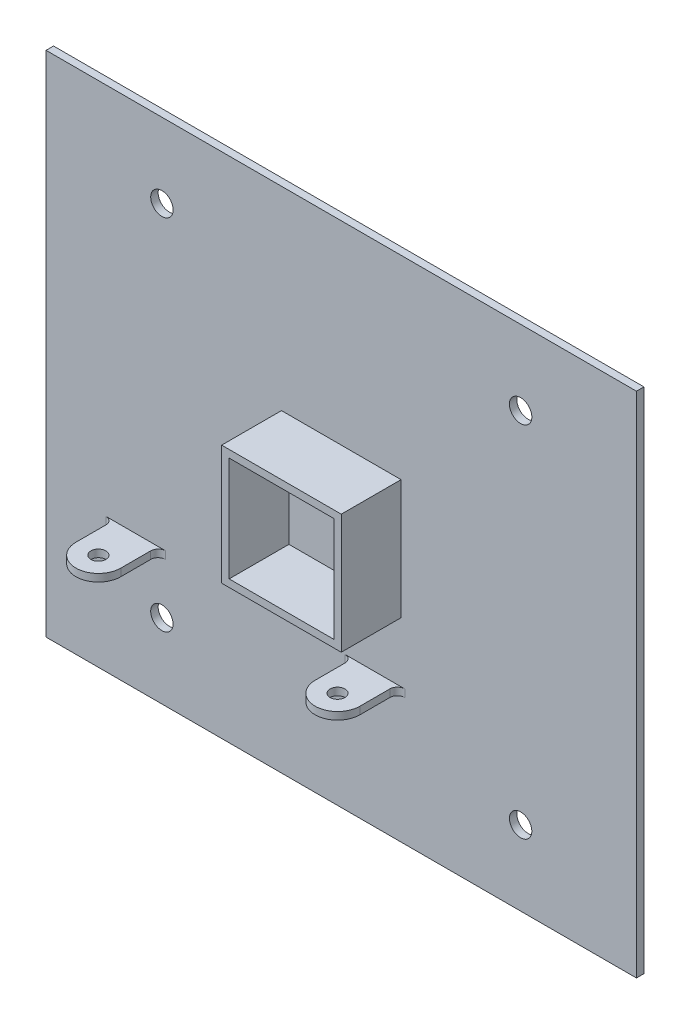
ISO-10303-21;
HEADER;
FILE_DESCRIPTION(('STEP AP214'),'2;1');
FILE_NAME('part.step','',(''),(''),'','','');
FILE_SCHEMA(('AUTOMOTIVE_DESIGN { 1 0 10303 214 1 1 1 1 }'));
ENDSEC;
DATA;
#1=APPLICATION_CONTEXT('core data for automotive mechanical design processes');
#2=APPLICATION_PROTOCOL_DEFINITION('international standard','automotive_design',2000,#1);
#3=PRODUCT_CONTEXT('',#1,'mechanical');
#4=PRODUCT('Part','Part','',(#3));
#5=PRODUCT_RELATED_PRODUCT_CATEGORY('part','',(#4));
#6=PRODUCT_DEFINITION_FORMATION('','',#4);
#7=PRODUCT_DEFINITION_CONTEXT('part definition',#1,'design');
#8=PRODUCT_DEFINITION('design','',#6,#7);
#9=PRODUCT_DEFINITION_SHAPE('','',#8);
#10=(LENGTH_UNIT() NAMED_UNIT(*) SI_UNIT(.MILLI.,.METRE.));
#11=(NAMED_UNIT(*) PLANE_ANGLE_UNIT() SI_UNIT($,.RADIAN.));
#12=(NAMED_UNIT(*) SI_UNIT($,.STERADIAN.) SOLID_ANGLE_UNIT());
#13=UNCERTAINTY_MEASURE_WITH_UNIT(LENGTH_MEASURE(1.E-05),#10,'distance_accuracy_value','');
#14=(GEOMETRIC_REPRESENTATION_CONTEXT(3) GLOBAL_UNCERTAINTY_ASSIGNED_CONTEXT((#13)) GLOBAL_UNIT_ASSIGNED_CONTEXT((#10,
#11,#12)) REPRESENTATION_CONTEXT('',''));
#15=CARTESIAN_POINT('',(0.,0.,0.));
#16=DIRECTION('',(0.,0.,1.));
#17=DIRECTION('',(1.,0.,0.));
#18=AXIS2_PLACEMENT_3D('',#15,#16,#17);
#19=CARTESIAN_POINT('',(0.,0.,101.6));
#20=DIRECTION('',(0.,0.,-1.));
#21=DIRECTION('',(-1.,0.,0.));
#22=AXIS2_PLACEMENT_3D('',#19,#20,#21);
#23=PLANE('',#22);
#24=DIRECTION('',(0.,-1.,0.));
#25=VECTOR('',#24,1.);
#26=CARTESIAN_POINT('',(-125.4125,0.,101.6));
#27=LINE('',#26,#25);
#28=CARTESIAN_POINT('',(-125.4125,107.95,101.6));
#29=VERTEX_POINT('',#28);
#30=CARTESIAN_POINT('',(-125.4125,-107.95,101.6));
#31=VERTEX_POINT('',#30);
#32=EDGE_CURVE('E378',#29,#31,#27,.T.);
#33=ORIENTED_EDGE('',*,*,#32,.T.);
#34=DIRECTION('',(-1.,0.,0.));
#35=VECTOR('',#34,1.);
#36=CARTESIAN_POINT('',(0.,-107.95,101.6));
#37=LINE('',#36,#35);
#38=CARTESIAN_POINT('',(125.4125,-107.95,101.6));
#39=VERTEX_POINT('',#38);
#40=EDGE_CURVE('E382',#39,#31,#37,.T.);
#41=ORIENTED_EDGE('',*,*,#40,.F.);
#42=DIRECTION('',(0.,-1.,0.));
#43=VECTOR('',#42,1.);
#44=CARTESIAN_POINT('',(125.4125,0.,101.6));
#45=LINE('',#44,#43);
#46=CARTESIAN_POINT('',(125.4125,107.95,101.6));
#47=VERTEX_POINT('',#46);
#48=EDGE_CURVE('E395',#47,#39,#45,.T.);
#49=ORIENTED_EDGE('',*,*,#48,.F.);
#50=DIRECTION('',(-1.,0.,0.));
#51=VECTOR('',#50,1.);
#52=CARTESIAN_POINT('',(0.,107.95,101.6));
#53=LINE('',#52,#51);
#54=EDGE_CURVE('E392',#47,#29,#53,.T.);
#55=ORIENTED_EDGE('',*,*,#54,.T.);
#56=EDGE_LOOP('',(#33,#41,#49,#55));
#57=FACE_BOUND('',#56,.T.);
#58=DIRECTION('',(0.,1.,0.));
#59=VECTOR('',#58,1.);
#60=CARTESIAN_POINT('',(-74.6125,-50.8,101.6));
#61=LINE('',#60,#59);
#62=CARTESIAN_POINT('',(-74.6125,-53.975,101.6));
#63=VERTEX_POINT('',#62);
#64=CARTESIAN_POINT('',(-74.6125,-50.8,101.6));
#65=VERTEX_POINT('',#64);
#66=EDGE_CURVE('E519',#63,#65,#61,.T.);
#67=ORIENTED_EDGE('',*,*,#66,.F.);
#68=DIRECTION('',(1.,0.,0.));
#69=VECTOR('',#68,1.);
#70=CARTESIAN_POINT('',(-74.6125,-53.975,101.6));
#71=LINE('',#70,#69);
#72=CARTESIAN_POINT('',(-100.0125,-53.975,101.6));
#73=VERTEX_POINT('',#72);
#74=EDGE_CURVE('E526',#73,#63,#71,.T.);
#75=ORIENTED_EDGE('',*,*,#74,.F.);
#76=DIRECTION('',(0.,-1.,0.));
#77=VECTOR('',#76,1.);
#78=CARTESIAN_POINT('',(-100.0125,-50.8,101.6));
#79=LINE('',#78,#77);
#80=CARTESIAN_POINT('',(-100.0125,-50.8,101.6));
#81=VERTEX_POINT('',#80);
#82=EDGE_CURVE('E524',#81,#73,#79,.T.);
#83=ORIENTED_EDGE('',*,*,#82,.F.);
#84=DIRECTION('',(-1.,0.,0.));
#85=VECTOR('',#84,1.);
#86=CARTESIAN_POINT('',(-74.6125,-50.8,101.6));
#87=LINE('',#86,#85);
#88=EDGE_CURVE('E521',#65,#81,#87,.T.);
#89=ORIENTED_EDGE('',*,*,#88,.F.);
#90=EDGE_LOOP('',(#67,#75,#83,#89));
#91=FACE_BOUND('',#90,.T.);
#92=DIRECTION('',(0.,-1.,0.));
#93=VECTOR('',#92,1.);
#94=CARTESIAN_POINT('',(1.58750000000003,-50.8,101.6));
#95=LINE('',#94,#93);
#96=CARTESIAN_POINT('',(1.58750000000003,-50.8,101.6));
#97=VERTEX_POINT('',#96);
#98=CARTESIAN_POINT('',(1.58750000000002,-53.975,101.6));
#99=VERTEX_POINT('',#98);
#100=EDGE_CURVE('E529',#97,#99,#95,.T.);
#101=ORIENTED_EDGE('',*,*,#100,.F.);
#102=DIRECTION('',(-1.,0.,0.));
#103=VECTOR('',#102,1.);
#104=CARTESIAN_POINT('',(1.58750000000003,-50.8,101.6));
#105=LINE('',#104,#103);
#106=CARTESIAN_POINT('',(26.9875,-50.8,101.6));
#107=VERTEX_POINT('',#106);
#108=EDGE_CURVE('E13',#107,#97,#105,.T.);
#109=ORIENTED_EDGE('',*,*,#108,.F.);
#110=DIRECTION('',(0.,1.,0.));
#111=VECTOR('',#110,1.);
#112=CARTESIAN_POINT('',(26.9875,-50.8,101.6));
#113=LINE('',#112,#111);
#114=CARTESIAN_POINT('',(26.9875,-53.975,101.6));
#115=VERTEX_POINT('',#114);
#116=EDGE_CURVE('E157',#115,#107,#113,.T.);
#117=ORIENTED_EDGE('',*,*,#116,.F.);
#118=DIRECTION('',(1.,0.,0.));
#119=VECTOR('',#118,1.);
#120=CARTESIAN_POINT('',(1.58750000000002,-53.975,101.6));
#121=LINE('',#120,#119);
#122=EDGE_CURVE('E531',#99,#115,#121,.T.);
#123=ORIENTED_EDGE('',*,*,#122,.F.);
#124=EDGE_LOOP('',(#101,#109,#117,#123));
#125=FACE_BOUND('',#124,.T.);
#126=CARTESIAN_POINT('',(-76.2,-76.2,101.6));
#127=DIRECTION('',(0.,0.,-1.));
#128=DIRECTION('',(-1.,0.,0.));
#129=AXIS2_PLACEMENT_3D('',#126,#127,#128);
#130=CIRCLE('',#129,4.7625);
#131=CARTESIAN_POINT('',(-80.9625,-76.2,101.6));
#132=VERTEX_POINT('',#131);
#133=EDGE_CURVE('E418',#132,#132,#130,.F.);
#134=ORIENTED_EDGE('',*,*,#133,.F.);
#135=EDGE_LOOP('',(#134));
#136=FACE_BOUND('',#135,.T.);
#137=CARTESIAN_POINT('',(76.2,-76.2,101.6));
#138=DIRECTION('',(0.,0.,-1.));
#139=DIRECTION('',(-1.,0.,0.));
#140=AXIS2_PLACEMENT_3D('',#137,#138,#139);
#141=CIRCLE('',#140,4.7625);
#142=CARTESIAN_POINT('',(71.4375,-76.2,101.6));
#143=VERTEX_POINT('',#142);
#144=EDGE_CURVE('E412',#143,#143,#141,.F.);
#145=ORIENTED_EDGE('',*,*,#144,.F.);
#146=EDGE_LOOP('',(#145));
#147=FACE_BOUND('',#146,.T.);
#148=CARTESIAN_POINT('',(-76.2,76.2,101.6));
#149=DIRECTION('',(0.,0.,-1.));
#150=DIRECTION('',(-1.,0.,0.));
#151=AXIS2_PLACEMENT_3D('',#148,#149,#150);
#152=CIRCLE('',#151,4.7625);
#153=CARTESIAN_POINT('',(-80.9625,76.2,101.6));
#154=VERTEX_POINT('',#153);
#155=EDGE_CURVE('E424',#154,#154,#152,.F.);
#156=ORIENTED_EDGE('',*,*,#155,.F.);
#157=EDGE_LOOP('',(#156));
#158=FACE_BOUND('',#157,.T.);
#159=CARTESIAN_POINT('',(76.2,76.2,101.6));
#160=DIRECTION('',(0.,0.,-1.));
#161=DIRECTION('',(-1.,0.,0.));
#162=AXIS2_PLACEMENT_3D('',#159,#160,#161);
#163=CIRCLE('',#162,4.7625);
#164=CARTESIAN_POINT('',(71.4375,76.2,101.6));
#165=VERTEX_POINT('',#164);
#166=EDGE_CURVE('E430',#165,#165,#163,.F.);
#167=ORIENTED_EDGE('',*,*,#166,.F.);
#168=EDGE_LOOP('',(#167));
#169=FACE_BOUND('',#168,.T.);
#170=DIRECTION('',(0.,1.,0.));
#171=VECTOR('',#170,1.);
#172=CARTESIAN_POINT('',(25.4,-25.4,101.6));
#173=LINE('',#172,#171);
#174=CARTESIAN_POINT('',(25.4,-25.4,101.6));
#175=VERTEX_POINT('',#174);
#176=CARTESIAN_POINT('',(25.4,25.4,101.6));
#177=VERTEX_POINT('',#176);
#178=EDGE_CURVE('E327',#175,#177,#173,.T.);
#179=ORIENTED_EDGE('',*,*,#178,.F.);
#180=DIRECTION('',(1.,0.,0.));
#181=VECTOR('',#180,1.);
#182=CARTESIAN_POINT('',(-25.4,-25.4,101.6));
#183=LINE('',#182,#181);
#184=CARTESIAN_POINT('',(-25.4,-25.4,101.6));
#185=VERTEX_POINT('',#184);
#186=EDGE_CURVE('E355',#185,#175,#183,.T.);
#187=ORIENTED_EDGE('',*,*,#186,.F.);
#188=DIRECTION('',(0.,-1.,0.));
#189=VECTOR('',#188,1.);
#190=CARTESIAN_POINT('',(-25.4,-25.4,101.6));
#191=LINE('',#190,#189);
#192=CARTESIAN_POINT('',(-25.4,25.4,101.6));
#193=VERTEX_POINT('',#192);
#194=EDGE_CURVE('E169',#193,#185,#191,.T.);
#195=ORIENTED_EDGE('',*,*,#194,.F.);
#196=DIRECTION('',(-1.,0.,0.));
#197=VECTOR('',#196,1.);
#198=CARTESIAN_POINT('',(-25.4,25.4,101.6));
#199=LINE('',#198,#197);
#200=EDGE_CURVE('E164',#177,#193,#199,.T.);
#201=ORIENTED_EDGE('',*,*,#200,.F.);
#202=EDGE_LOOP('',(#179,#187,#195,#201));
#203=FACE_BOUND('',#202,.T.);
#204=ADVANCED_FACE('F149',(#57,#91,#125,#136,#147,#158,#169,#203),#23,.F.);
#205=CARTESIAN_POINT('',(0.,0.,98.425));
#206=DIRECTION('',(0.,0.,-1.));
#207=DIRECTION('',(-1.,0.,0.));
#208=AXIS2_PLACEMENT_3D('',#205,#206,#207);
#209=PLANE('',#208);
#210=CARTESIAN_POINT('',(76.2,76.2,98.425));
#211=DIRECTION('',(0.,0.,-1.));
#212=DIRECTION('',(-1.,0.,0.));
#213=AXIS2_PLACEMENT_3D('',#210,#211,#212);
#214=CIRCLE('',#213,4.7625);
#215=CARTESIAN_POINT('',(71.4375,76.2,98.425));
#216=VERTEX_POINT('',#215);
#217=EDGE_CURVE('E427',#216,#216,#214,.T.);
#218=ORIENTED_EDGE('',*,*,#217,.F.);
#219=EDGE_LOOP('',(#218));
#220=FACE_BOUND('',#219,.T.);
#221=CARTESIAN_POINT('',(-76.2,76.2,98.425));
#222=DIRECTION('',(0.,0.,-1.));
#223=DIRECTION('',(-1.,0.,0.));
#224=AXIS2_PLACEMENT_3D('',#221,#222,#223);
#225=CIRCLE('',#224,4.7625);
#226=CARTESIAN_POINT('',(-80.9625,76.2,98.425));
#227=VERTEX_POINT('',#226);
#228=EDGE_CURVE('E421',#227,#227,#225,.T.);
#229=ORIENTED_EDGE('',*,*,#228,.F.);
#230=EDGE_LOOP('',(#229));
#231=FACE_BOUND('',#230,.T.);
#232=CARTESIAN_POINT('',(-76.2,-76.2,98.425));
#233=DIRECTION('',(0.,0.,-1.));
#234=DIRECTION('',(-1.,0.,0.));
#235=AXIS2_PLACEMENT_3D('',#232,#233,#234);
#236=CIRCLE('',#235,4.7625);
#237=CARTESIAN_POINT('',(-80.9625,-76.2,98.425));
#238=VERTEX_POINT('',#237);
#239=EDGE_CURVE('E415',#238,#238,#236,.T.);
#240=ORIENTED_EDGE('',*,*,#239,.F.);
#241=EDGE_LOOP('',(#240));
#242=FACE_BOUND('',#241,.T.);
#243=CARTESIAN_POINT('',(76.2,-76.2,98.425));
#244=DIRECTION('',(0.,0.,-1.));
#245=DIRECTION('',(-1.,0.,0.));
#246=AXIS2_PLACEMENT_3D('',#243,#244,#245);
#247=CIRCLE('',#246,4.7625);
#248=CARTESIAN_POINT('',(71.4375,-76.2,98.425));
#249=VERTEX_POINT('',#248);
#250=EDGE_CURVE('E402',#249,#249,#247,.T.);
#251=ORIENTED_EDGE('',*,*,#250,.F.);
#252=EDGE_LOOP('',(#251));
#253=FACE_BOUND('',#252,.T.);
#254=DIRECTION('',(-1.,0.,0.));
#255=VECTOR('',#254,1.);
#256=CARTESIAN_POINT('',(0.,-107.95,98.425));
#257=LINE('',#256,#255);
#258=CARTESIAN_POINT('',(125.4125,-107.95,98.425));
#259=VERTEX_POINT('',#258);
#260=CARTESIAN_POINT('',(-125.4125,-107.95,98.425));
#261=VERTEX_POINT('',#260);
#262=EDGE_CURVE('E387',#259,#261,#257,.T.);
#263=ORIENTED_EDGE('',*,*,#262,.T.);
#264=DIRECTION('',(0.,-1.,0.));
#265=VECTOR('',#264,1.);
#266=CARTESIAN_POINT('',(-125.4125,0.,98.425));
#267=LINE('',#266,#265);
#268=CARTESIAN_POINT('',(-125.4125,107.95,98.425));
#269=VERTEX_POINT('',#268);
#270=EDGE_CURVE('E379',#269,#261,#267,.T.);
#271=ORIENTED_EDGE('',*,*,#270,.F.);
#272=DIRECTION('',(-1.,0.,0.));
#273=VECTOR('',#272,1.);
#274=CARTESIAN_POINT('',(0.,107.95,98.425));
#275=LINE('',#274,#273);
#276=CARTESIAN_POINT('',(125.4125,107.95,98.425));
#277=VERTEX_POINT('',#276);
#278=EDGE_CURVE('E381',#277,#269,#275,.T.);
#279=ORIENTED_EDGE('',*,*,#278,.F.);
#280=DIRECTION('',(0.,-1.,0.));
#281=VECTOR('',#280,1.);
#282=CARTESIAN_POINT('',(125.4125,0.,98.425));
#283=LINE('',#282,#281);
#284=EDGE_CURVE('E384',#277,#259,#283,.T.);
#285=ORIENTED_EDGE('',*,*,#284,.T.);
#286=EDGE_LOOP('',(#263,#271,#279,#285));
#287=FACE_BOUND('',#286,.T.);
#288=ADVANCED_FACE('F576',(#220,#231,#242,#253,#287),#209,.T.);
#289=CARTESIAN_POINT('',(1.58750000000002,-53.975,127.));
#290=DIRECTION('',(0.,1.,0.));
#291=DIRECTION('',(0.,0.,1.));
#292=AXIS2_PLACEMENT_3D('',#289,#290,#291);
#293=PLANE('',#292);
#294=CARTESIAN_POINT('',(14.2875,-53.975,117.475));
#295=DIRECTION('',(0.,-1.,0.));
#296=DIRECTION('',(1.,0.,0.));
#297=AXIS2_PLACEMENT_3D('',#294,#295,#296);
#298=CIRCLE('',#297,3.175);
#299=CARTESIAN_POINT('',(17.4625,-53.975,117.475));
#300=VERTEX_POINT('',#299);
#301=EDGE_CURVE('E452',#300,#300,#298,.T.);
#302=ORIENTED_EDGE('',*,*,#301,.F.);
#303=EDGE_LOOP('',(#302));
#304=FACE_BOUND('',#303,.T.);
#305=ORIENTED_EDGE('',*,*,#122,.T.);
#306=CARTESIAN_POINT('',(26.9875,-53.975,104.775));
#307=DIRECTION('',(0.,-1.,0.));
#308=DIRECTION('',(1.,0.,0.));
#309=AXIS2_PLACEMENT_3D('',#306,#307,#308);
#310=CIRCLE('',#309,3.175);
#311=CARTESIAN_POINT('',(23.8125,-53.975,104.775));
#312=VERTEX_POINT('',#311);
#313=EDGE_CURVE('E440',#312,#115,#310,.T.);
#314=ORIENTED_EDGE('',*,*,#313,.F.);
#315=DIRECTION('',(0.,0.,-1.));
#316=VECTOR('',#315,1.);
#317=CARTESIAN_POINT('',(23.8125,-53.975,0.));
#318=LINE('',#317,#316);
#319=CARTESIAN_POINT('',(23.8125,-53.975,117.475));
#320=VERTEX_POINT('',#319);
#321=EDGE_CURVE('E444',#320,#312,#318,.T.);
#322=ORIENTED_EDGE('',*,*,#321,.F.);
#323=CARTESIAN_POINT('',(14.2875,-53.975,117.475));
#324=DIRECTION('',(0.,-1.,0.));
#325=DIRECTION('',(1.,0.,0.));
#326=AXIS2_PLACEMENT_3D('',#323,#324,#325);
#327=CIRCLE('',#326,9.525);
#328=CARTESIAN_POINT('',(4.7625,-53.975,117.475));
#329=VERTEX_POINT('',#328);
#330=EDGE_CURVE('E459',#320,#329,#327,.T.);
#331=ORIENTED_EDGE('',*,*,#330,.T.);
#332=DIRECTION('',(0.,0.,-1.));
#333=VECTOR('',#332,1.);
#334=CARTESIAN_POINT('',(4.76250000000004,-53.975,0.));
#335=LINE('',#334,#333);
#336=CARTESIAN_POINT('',(4.7625,-53.975,104.775));
#337=VERTEX_POINT('',#336);
#338=EDGE_CURVE('E464',#329,#337,#335,.T.);
#339=ORIENTED_EDGE('',*,*,#338,.T.);
#340=CARTESIAN_POINT('',(1.58750000000001,-53.975,104.775));
#341=DIRECTION('',(0.,-1.,0.));
#342=DIRECTION('',(1.,0.,0.));
#343=AXIS2_PLACEMENT_3D('',#340,#341,#342);
#344=CIRCLE('',#343,3.175);
#345=EDGE_CURVE('E467',#337,#99,#344,.F.);
#346=ORIENTED_EDGE('',*,*,#345,.T.);
#347=EDGE_LOOP('',(#305,#314,#322,#331,#339,#346));
#348=FACE_BOUND('',#347,.T.);
#349=ADVANCED_FACE('F552',(#304,#348),#293,.F.);
#350=CARTESIAN_POINT('',(1.58750000000003,-50.8,127.));
#351=DIRECTION('',(0.,-1.,0.));
#352=DIRECTION('',(0.,0.,-1.));
#353=AXIS2_PLACEMENT_3D('',#350,#351,#352);
#354=PLANE('',#353);
#355=DIRECTION('',(0.,0.,1.));
#356=VECTOR('',#355,1.);
#357=CARTESIAN_POINT('',(23.8125,-50.8,0.));
#358=LINE('',#357,#356);
#359=CARTESIAN_POINT('',(23.8125,-50.8,104.775));
#360=VERTEX_POINT('',#359);
#361=CARTESIAN_POINT('',(23.8125,-50.8,117.475));
#362=VERTEX_POINT('',#361);
#363=EDGE_CURVE('E441',#360,#362,#358,.T.);
#364=ORIENTED_EDGE('',*,*,#363,.F.);
#365=CARTESIAN_POINT('',(26.9875,-50.8,104.775));
#366=DIRECTION('',(0.,-1.,0.));
#367=DIRECTION('',(0.,0.,-1.));
#368=AXIS2_PLACEMENT_3D('',#365,#366,#367);
#369=CIRCLE('',#368,3.175);
#370=EDGE_CURVE('E433',#107,#360,#369,.F.);
#371=ORIENTED_EDGE('',*,*,#370,.F.);
#372=ORIENTED_EDGE('',*,*,#108,.T.);
#373=CARTESIAN_POINT('',(1.58750000000001,-50.8,104.775));
#374=DIRECTION('',(0.,-1.,0.));
#375=DIRECTION('',(0.,0.,-1.));
#376=AXIS2_PLACEMENT_3D('',#373,#374,#375);
#377=CIRCLE('',#376,3.175);
#378=CARTESIAN_POINT('',(4.7625,-50.8,104.775));
#379=VERTEX_POINT('',#378);
#380=EDGE_CURVE('E462',#97,#379,#377,.T.);
#381=ORIENTED_EDGE('',*,*,#380,.T.);
#382=DIRECTION('',(0.,0.,1.));
#383=VECTOR('',#382,1.);
#384=CARTESIAN_POINT('',(4.76250000000004,-50.8,0.));
#385=LINE('',#384,#383);
#386=CARTESIAN_POINT('',(4.7625,-50.8,117.475));
#387=VERTEX_POINT('',#386);
#388=EDGE_CURVE('E455',#379,#387,#385,.T.);
#389=ORIENTED_EDGE('',*,*,#388,.T.);
#390=CARTESIAN_POINT('',(14.2875,-50.8,117.475));
#391=DIRECTION('',(0.,-1.,0.));
#392=DIRECTION('',(0.,0.,-1.));
#393=AXIS2_PLACEMENT_3D('',#390,#391,#392);
#394=CIRCLE('',#393,9.525);
#395=EDGE_CURVE('E463',#387,#362,#394,.F.);
#396=ORIENTED_EDGE('',*,*,#395,.T.);
#397=EDGE_LOOP('',(#364,#371,#372,#381,#389,#396));
#398=FACE_BOUND('',#397,.T.);
#399=CARTESIAN_POINT('',(14.2875,-50.8,117.475));
#400=DIRECTION('',(0.,-1.,0.));
#401=DIRECTION('',(0.,0.,-1.));
#402=AXIS2_PLACEMENT_3D('',#399,#400,#401);
#403=CIRCLE('',#402,3.175);
#404=CARTESIAN_POINT('',(14.2875,-50.8,114.3));
#405=VERTEX_POINT('',#404);
#406=EDGE_CURVE('E436',#405,#405,#403,.F.);
#407=ORIENTED_EDGE('',*,*,#406,.F.);
#408=EDGE_LOOP('',(#407));
#409=FACE_BOUND('',#408,.T.);
#410=ADVANCED_FACE('F543',(#398,#409),#354,.F.);
#411=CARTESIAN_POINT('',(-74.6125,-50.8,127.));
#412=DIRECTION('',(0.,-1.,0.));
#413=DIRECTION('',(1.,0.,0.));
#414=AXIS2_PLACEMENT_3D('',#411,#412,#413);
#415=PLANE('',#414);
#416=CARTESIAN_POINT('',(-87.3125,-50.8,117.475));
#417=DIRECTION('',(0.,-1.,0.));
#418=DIRECTION('',(1.,0.,0.));
#419=AXIS2_PLACEMENT_3D('',#416,#417,#418);
#420=CIRCLE('',#419,3.175);
#421=CARTESIAN_POINT('',(-84.1375,-50.8,117.475));
#422=VERTEX_POINT('',#421);
#423=EDGE_CURVE('E516',#422,#422,#420,.F.);
#424=ORIENTED_EDGE('',*,*,#423,.F.);
#425=EDGE_LOOP('',(#424));
#426=FACE_BOUND('',#425,.T.);
#427=CARTESIAN_POINT('',(-87.3125,-50.8,117.475));
#428=DIRECTION('',(0.,-1.,0.));
#429=DIRECTION('',(1.,0.,0.));
#430=AXIS2_PLACEMENT_3D('',#427,#428,#429);
#431=CIRCLE('',#430,9.52500000000001);
#432=CARTESIAN_POINT('',(-96.8375,-50.8,117.475));
#433=VERTEX_POINT('',#432);
#434=CARTESIAN_POINT('',(-77.7875,-50.8,117.475));
#435=VERTEX_POINT('',#434);
#436=EDGE_CURVE('E492',#433,#435,#431,.F.);
#437=ORIENTED_EDGE('',*,*,#436,.T.);
#438=DIRECTION('',(0.,0.,1.));
#439=VECTOR('',#438,1.);
#440=CARTESIAN_POINT('',(-77.7874999999999,-50.8,0.));
#441=LINE('',#440,#439);
#442=CARTESIAN_POINT('',(-77.7875,-50.8,104.775));
#443=VERTEX_POINT('',#442);
#444=EDGE_CURVE('E480',#443,#435,#441,.T.);
#445=ORIENTED_EDGE('',*,*,#444,.F.);
#446=CARTESIAN_POINT('',(-74.6125,-50.8,104.775));
#447=DIRECTION('',(0.,-1.,0.));
#448=DIRECTION('',(1.,0.,0.));
#449=AXIS2_PLACEMENT_3D('',#446,#447,#448);
#450=CIRCLE('',#449,3.17499999999999);
#451=EDGE_CURVE('E477',#65,#443,#450,.F.);
#452=ORIENTED_EDGE('',*,*,#451,.F.);
#453=ORIENTED_EDGE('',*,*,#88,.T.);
#454=CARTESIAN_POINT('',(-100.0125,-50.8,104.775));
#455=DIRECTION('',(0.,-1.,0.));
#456=DIRECTION('',(1.,0.,0.));
#457=AXIS2_PLACEMENT_3D('',#454,#455,#456);
#458=CIRCLE('',#457,3.17499999999998);
#459=CARTESIAN_POINT('',(-96.8375,-50.8,104.775));
#460=VERTEX_POINT('',#459);
#461=EDGE_CURVE('E494',#81,#460,#458,.T.);
#462=ORIENTED_EDGE('',*,*,#461,.T.);
#463=DIRECTION('',(0.,0.,1.));
#464=VECTOR('',#463,1.);
#465=CARTESIAN_POINT('',(-96.8375000000001,-50.8,1.05818132034585E-13));
#466=LINE('',#465,#464);
#467=EDGE_CURVE('E509',#460,#433,#466,.T.);
#468=ORIENTED_EDGE('',*,*,#467,.T.);
#469=EDGE_LOOP('',(#437,#445,#452,#453,#462,#468));
#470=FACE_BOUND('',#469,.T.);
#471=ADVANCED_FACE('F913',(#426,#470),#415,.F.);
#472=CARTESIAN_POINT('',(-74.6125,-53.975,127.));
#473=DIRECTION('',(0.,1.,0.));
#474=DIRECTION('',(-1.,0.,0.));
#475=AXIS2_PLACEMENT_3D('',#472,#473,#474);
#476=PLANE('',#475);
#477=CARTESIAN_POINT('',(-87.3125,-53.975,117.475));
#478=DIRECTION('',(0.,-1.,0.));
#479=DIRECTION('',(1.,0.,0.));
#480=AXIS2_PLACEMENT_3D('',#477,#478,#479);
#481=CIRCLE('',#480,3.175);
#482=CARTESIAN_POINT('',(-84.1375,-53.975,117.475));
#483=VERTEX_POINT('',#482);
#484=EDGE_CURVE('E513',#483,#483,#481,.T.);
#485=ORIENTED_EDGE('',*,*,#484,.F.);
#486=EDGE_LOOP('',(#485));
#487=FACE_BOUND('',#486,.T.);
#488=DIRECTION('',(0.,0.,-1.));
#489=VECTOR('',#488,1.);
#490=CARTESIAN_POINT('',(-77.7874999999999,-53.975,0.));
#491=LINE('',#490,#489);
#492=CARTESIAN_POINT('',(-77.7875,-53.975,117.475));
#493=VERTEX_POINT('',#492);
#494=CARTESIAN_POINT('',(-77.7875,-53.975,104.775));
#495=VERTEX_POINT('',#494);
#496=EDGE_CURVE('E486',#493,#495,#491,.T.);
#497=ORIENTED_EDGE('',*,*,#496,.F.);
#498=CARTESIAN_POINT('',(-87.3125,-53.975,117.475));
#499=DIRECTION('',(0.,-1.,0.));
#500=DIRECTION('',(1.,0.,0.));
#501=AXIS2_PLACEMENT_3D('',#498,#499,#500);
#502=CIRCLE('',#501,9.52500000000001);
#503=CARTESIAN_POINT('',(-96.8375,-53.975,117.475));
#504=VERTEX_POINT('',#503);
#505=EDGE_CURVE('E503',#493,#504,#502,.T.);
#506=ORIENTED_EDGE('',*,*,#505,.T.);
#507=DIRECTION('',(0.,0.,-1.));
#508=VECTOR('',#507,1.);
#509=CARTESIAN_POINT('',(-96.8375000000001,-53.975,1.05818132034585E-13));
#510=LINE('',#509,#508);
#511=CARTESIAN_POINT('',(-96.8375,-53.975,104.775));
#512=VERTEX_POINT('',#511);
#513=EDGE_CURVE('E500',#504,#512,#510,.T.);
#514=ORIENTED_EDGE('',*,*,#513,.T.);
#515=CARTESIAN_POINT('',(-100.0125,-53.975,104.775));
#516=DIRECTION('',(0.,-1.,0.));
#517=DIRECTION('',(1.,0.,0.));
#518=AXIS2_PLACEMENT_3D('',#515,#516,#517);
#519=CIRCLE('',#518,3.17499999999998);
#520=EDGE_CURVE('E497',#512,#73,#519,.F.);
#521=ORIENTED_EDGE('',*,*,#520,.T.);
#522=ORIENTED_EDGE('',*,*,#74,.T.);
#523=CARTESIAN_POINT('',(-74.6125,-53.975,104.775));
#524=DIRECTION('',(0.,-1.,0.));
#525=DIRECTION('',(1.,0.,0.));
#526=AXIS2_PLACEMENT_3D('',#523,#524,#525);
#527=CIRCLE('',#526,3.17499999999999);
#528=EDGE_CURVE('E481',#495,#63,#527,.T.);
#529=ORIENTED_EDGE('',*,*,#528,.F.);
#530=EDGE_LOOP('',(#497,#506,#514,#521,#522,#529));
#531=FACE_BOUND('',#530,.T.);
#532=ADVANCED_FACE('F903',(#487,#531),#476,.F.);
#533=CARTESIAN_POINT('',(-87.3125000000001,152.401,117.475));
#534=DIRECTION('',(0.,-1.,0.));
#535=DIRECTION('',(1.,0.,0.));
#536=AXIS2_PLACEMENT_3D('',#533,#534,#535);
#537=CYLINDRICAL_SURFACE('',#536,3.175);
#538=ORIENTED_EDGE('',*,*,#484,.T.);
#539=EDGE_LOOP('',(#538));
#540=FACE_BOUND('',#539,.T.);
#541=ORIENTED_EDGE('',*,*,#423,.T.);
#542=EDGE_LOOP('',(#541));
#543=FACE_BOUND('',#542,.T.);
#544=ADVANCED_FACE('F893',(#540,#543),#537,.F.);
#545=CARTESIAN_POINT('',(-100.0125,152.401,104.775));
#546=DIRECTION('',(0.,-1.,0.));
#547=DIRECTION('',(1.,0.,0.));
#548=AXIS2_PLACEMENT_3D('',#545,#546,#547);
#549=CYLINDRICAL_SURFACE('',#548,3.17499999999998);
#550=ORIENTED_EDGE('',*,*,#82,.T.);
#551=ORIENTED_EDGE('',*,*,#520,.F.);
#552=DIRECTION('',(0.,-1.,0.));
#553=VECTOR('',#552,1.);
#554=CARTESIAN_POINT('',(-96.8375000000001,152.401,104.775));
#555=LINE('',#554,#553);
#556=EDGE_CURVE('E506',#460,#512,#555,.T.);
#557=ORIENTED_EDGE('',*,*,#556,.F.);
#558=ORIENTED_EDGE('',*,*,#461,.F.);
#559=EDGE_LOOP('',(#550,#551,#557,#558));
#560=FACE_BOUND('',#559,.T.);
#561=ADVANCED_FACE('F882',(#560),#549,.F.);
#562=CARTESIAN_POINT('',(-87.3125000000001,152.401,117.475));
#563=DIRECTION('',(0.,-1.,0.));
#564=DIRECTION('',(1.,0.,0.));
#565=AXIS2_PLACEMENT_3D('',#562,#563,#564);
#566=CYLINDRICAL_SURFACE('',#565,9.52500000000001);
#567=DIRECTION('',(0.,-1.,0.));
#568=VECTOR('',#567,1.);
#569=CARTESIAN_POINT('',(-96.8375000000001,152.401,117.475));
#570=LINE('',#569,#568);
#571=EDGE_CURVE('E507',#433,#504,#570,.T.);
#572=ORIENTED_EDGE('',*,*,#571,.T.);
#573=ORIENTED_EDGE('',*,*,#505,.F.);
#574=DIRECTION('',(0.,-1.,0.));
#575=VECTOR('',#574,1.);
#576=CARTESIAN_POINT('',(-77.7875000000001,152.401,117.475));
#577=LINE('',#576,#575);
#578=EDGE_CURVE('E483',#435,#493,#577,.T.);
#579=ORIENTED_EDGE('',*,*,#578,.F.);
#580=ORIENTED_EDGE('',*,*,#436,.F.);
#581=EDGE_LOOP('',(#572,#573,#579,#580));
#582=FACE_BOUND('',#581,.T.);
#583=ADVANCED_FACE('F872',(#582),#566,.T.);
#584=CARTESIAN_POINT('',(-96.8375000000002,152.401,1.05818132034585E-13));
#585=DIRECTION('',(-1.,0.,0.));
#586=DIRECTION('',(0.,0.,1.));
#587=AXIS2_PLACEMENT_3D('',#584,#585,#586);
#588=PLANE('',#587);
#589=ORIENTED_EDGE('',*,*,#556,.T.);
#590=ORIENTED_EDGE('',*,*,#513,.F.);
#591=ORIENTED_EDGE('',*,*,#571,.F.);
#592=ORIENTED_EDGE('',*,*,#467,.F.);
#593=EDGE_LOOP('',(#589,#590,#591,#592));
#594=FACE_BOUND('',#593,.T.);
#595=ADVANCED_FACE('F862',(#594),#588,.T.);
#596=CARTESIAN_POINT('',(-77.7874999999999,152.401,0.));
#597=DIRECTION('',(-1.,0.,0.));
#598=DIRECTION('',(0.,0.,1.));
#599=AXIS2_PLACEMENT_3D('',#596,#597,#598);
#600=PLANE('',#599);
#601=ORIENTED_EDGE('',*,*,#444,.T.);
#602=ORIENTED_EDGE('',*,*,#578,.T.);
#603=ORIENTED_EDGE('',*,*,#496,.T.);
#604=DIRECTION('',(0.,-1.,0.));
#605=VECTOR('',#604,1.);
#606=CARTESIAN_POINT('',(-77.7875,152.401,104.775));
#607=LINE('',#606,#605);
#608=EDGE_CURVE('E470',#443,#495,#607,.T.);
#609=ORIENTED_EDGE('',*,*,#608,.F.);
#610=EDGE_LOOP('',(#601,#602,#603,#609));
#611=FACE_BOUND('',#610,.T.);
#612=ADVANCED_FACE('F852',(#611),#600,.F.);
#613=CARTESIAN_POINT('',(-74.6125000000001,152.401,104.775));
#614=DIRECTION('',(0.,-1.,0.));
#615=DIRECTION('',(1.,0.,0.));
#616=AXIS2_PLACEMENT_3D('',#613,#614,#615);
#617=CYLINDRICAL_SURFACE('',#616,3.17499999999999);
#618=ORIENTED_EDGE('',*,*,#451,.T.);
#619=ORIENTED_EDGE('',*,*,#608,.T.);
#620=ORIENTED_EDGE('',*,*,#528,.T.);
#621=ORIENTED_EDGE('',*,*,#66,.T.);
#622=EDGE_LOOP('',(#618,#619,#620,#621));
#623=FACE_BOUND('',#622,.T.);
#624=ADVANCED_FACE('F843',(#623),#617,.F.);
#625=CARTESIAN_POINT('',(4.76249999999998,152.401,0.));
#626=DIRECTION('',(-1.,0.,0.));
#627=DIRECTION('',(0.,0.,1.));
#628=AXIS2_PLACEMENT_3D('',#625,#626,#627);
#629=PLANE('',#628);
#630=DIRECTION('',(0.,-1.,0.));
#631=VECTOR('',#630,1.);
#632=CARTESIAN_POINT('',(4.76249999999995,152.401,104.775));
#633=LINE('',#632,#631);
#634=EDGE_CURVE('E471',#379,#337,#633,.T.);
#635=ORIENTED_EDGE('',*,*,#634,.T.);
#636=ORIENTED_EDGE('',*,*,#338,.F.);
#637=DIRECTION('',(0.,-1.,0.));
#638=VECTOR('',#637,1.);
#639=CARTESIAN_POINT('',(4.76249999999994,152.401,117.475));
#640=LINE('',#639,#638);
#641=EDGE_CURVE('E458',#387,#329,#640,.T.);
#642=ORIENTED_EDGE('',*,*,#641,.F.);
#643=ORIENTED_EDGE('',*,*,#388,.F.);
#644=EDGE_LOOP('',(#635,#636,#642,#643));
#645=FACE_BOUND('',#644,.T.);
#646=ADVANCED_FACE('F557',(#645),#629,.T.);
#647=CARTESIAN_POINT('',(14.2874999999999,152.401,117.475));
#648=DIRECTION('',(0.,-1.,0.));
#649=DIRECTION('',(1.,0.,0.));
#650=AXIS2_PLACEMENT_3D('',#647,#648,#649);
#651=CYLINDRICAL_SURFACE('',#650,9.525);
#652=ORIENTED_EDGE('',*,*,#641,.T.);
#653=ORIENTED_EDGE('',*,*,#330,.F.);
#654=DIRECTION('',(0.,-1.,0.));
#655=VECTOR('',#654,1.);
#656=CARTESIAN_POINT('',(23.8124999999999,152.401,117.475));
#657=LINE('',#656,#655);
#658=EDGE_CURVE('E437',#362,#320,#657,.T.);
#659=ORIENTED_EDGE('',*,*,#658,.F.);
#660=ORIENTED_EDGE('',*,*,#395,.F.);
#661=EDGE_LOOP('',(#652,#653,#659,#660));
#662=FACE_BOUND('',#661,.T.);
#663=ADVANCED_FACE('F560',(#662),#651,.T.);
#664=CARTESIAN_POINT('',(1.58749999999995,152.401,104.775));
#665=DIRECTION('',(0.,-1.,0.));
#666=DIRECTION('',(1.,0.,0.));
#667=AXIS2_PLACEMENT_3D('',#664,#665,#666);
#668=CYLINDRICAL_SURFACE('',#667,3.175);
#669=ORIENTED_EDGE('',*,*,#100,.T.);
#670=ORIENTED_EDGE('',*,*,#345,.F.);
#671=ORIENTED_EDGE('',*,*,#634,.F.);
#672=ORIENTED_EDGE('',*,*,#380,.F.);
#673=EDGE_LOOP('',(#669,#670,#671,#672));
#674=FACE_BOUND('',#673,.T.);
#675=ADVANCED_FACE('F549',(#674),#668,.F.);
#676=CARTESIAN_POINT('',(14.2874999999999,152.401,117.475));
#677=DIRECTION('',(0.,-1.,0.));
#678=DIRECTION('',(1.,0.,0.));
#679=AXIS2_PLACEMENT_3D('',#676,#677,#678);
#680=CYLINDRICAL_SURFACE('',#679,3.175);
#681=ORIENTED_EDGE('',*,*,#301,.T.);
#682=EDGE_LOOP('',(#681));
#683=FACE_BOUND('',#682,.T.);
#684=ORIENTED_EDGE('',*,*,#406,.T.);
#685=EDGE_LOOP('',(#684));
#686=FACE_BOUND('',#685,.T.);
#687=ADVANCED_FACE('F573',(#683,#686),#680,.F.);
#688=CARTESIAN_POINT('',(26.9874999999999,152.401,104.775));
#689=DIRECTION('',(0.,-1.,0.));
#690=DIRECTION('',(1.,0.,0.));
#691=AXIS2_PLACEMENT_3D('',#688,#689,#690);
#692=CYLINDRICAL_SURFACE('',#691,3.175);
#693=ORIENTED_EDGE('',*,*,#370,.T.);
#694=DIRECTION('',(0.,-1.,0.));
#695=VECTOR('',#694,1.);
#696=CARTESIAN_POINT('',(23.8125,152.401,104.775));
#697=LINE('',#696,#695);
#698=EDGE_CURVE('E434',#360,#312,#697,.T.);
#699=ORIENTED_EDGE('',*,*,#698,.T.);
#700=ORIENTED_EDGE('',*,*,#313,.T.);
#701=ORIENTED_EDGE('',*,*,#116,.T.);
#702=EDGE_LOOP('',(#693,#699,#700,#701));
#703=FACE_BOUND('',#702,.T.);
#704=ADVANCED_FACE('F536',(#703),#692,.F.);
#705=CARTESIAN_POINT('',(23.8125,152.401,0.));
#706=DIRECTION('',(-1.,0.,0.));
#707=DIRECTION('',(0.,0.,1.));
#708=AXIS2_PLACEMENT_3D('',#705,#706,#707);
#709=PLANE('',#708);
#710=ORIENTED_EDGE('',*,*,#363,.T.);
#711=ORIENTED_EDGE('',*,*,#658,.T.);
#712=ORIENTED_EDGE('',*,*,#321,.T.);
#713=ORIENTED_EDGE('',*,*,#698,.F.);
#714=EDGE_LOOP('',(#710,#711,#712,#713));
#715=FACE_BOUND('',#714,.T.);
#716=ADVANCED_FACE('F562',(#715),#709,.F.);
#717=CARTESIAN_POINT('',(76.2,76.2,154.109405159463));
#718=DIRECTION('',(0.,0.,-1.));
#719=DIRECTION('',(-1.,0.,0.));
#720=AXIS2_PLACEMENT_3D('',#717,#718,#719);
#721=CYLINDRICAL_SURFACE('',#720,4.7625);
#722=ORIENTED_EDGE('',*,*,#217,.T.);
#723=EDGE_LOOP('',(#722));
#724=FACE_BOUND('',#723,.T.);
#725=ORIENTED_EDGE('',*,*,#166,.T.);
#726=EDGE_LOOP('',(#725));
#727=FACE_BOUND('',#726,.T.);
#728=ADVANCED_FACE('F564',(#724,#727),#721,.F.);
#729=CARTESIAN_POINT('',(-76.2,76.2,154.109405159463));
#730=DIRECTION('',(0.,0.,-1.));
#731=DIRECTION('',(-1.,0.,0.));
#732=AXIS2_PLACEMENT_3D('',#729,#730,#731);
#733=CYLINDRICAL_SURFACE('',#732,4.7625);
#734=ORIENTED_EDGE('',*,*,#228,.T.);
#735=EDGE_LOOP('',(#734));
#736=FACE_BOUND('',#735,.T.);
#737=ORIENTED_EDGE('',*,*,#155,.T.);
#738=EDGE_LOOP('',(#737));
#739=FACE_BOUND('',#738,.T.);
#740=ADVANCED_FACE('F570',(#736,#739),#733,.F.);
#741=CARTESIAN_POINT('',(-76.2,-76.2,154.109405159463));
#742=DIRECTION('',(0.,0.,-1.));
#743=DIRECTION('',(-1.,0.,0.));
#744=AXIS2_PLACEMENT_3D('',#741,#742,#743);
#745=CYLINDRICAL_SURFACE('',#744,4.7625);
#746=ORIENTED_EDGE('',*,*,#239,.T.);
#747=EDGE_LOOP('',(#746));
#748=FACE_BOUND('',#747,.T.);
#749=ORIENTED_EDGE('',*,*,#133,.T.);
#750=EDGE_LOOP('',(#749));
#751=FACE_BOUND('',#750,.T.);
#752=ADVANCED_FACE('F642',(#748,#751),#745,.F.);
#753=CARTESIAN_POINT('',(76.2,-76.2,154.109405159463));
#754=DIRECTION('',(0.,0.,-1.));
#755=DIRECTION('',(-1.,0.,0.));
#756=AXIS2_PLACEMENT_3D('',#753,#754,#755);
#757=CYLINDRICAL_SURFACE('',#756,4.7625);
#758=ORIENTED_EDGE('',*,*,#250,.T.);
#759=EDGE_LOOP('',(#758));
#760=FACE_BOUND('',#759,.T.);
#761=ORIENTED_EDGE('',*,*,#144,.T.);
#762=EDGE_LOOP('',(#761));
#763=FACE_BOUND('',#762,.T.);
#764=ADVANCED_FACE('F638',(#760,#763),#757,.F.);
#765=CARTESIAN_POINT('',(-125.4125,0.,98.425));
#766=DIRECTION('',(-1.,0.,0.));
#767=DIRECTION('',(0.,0.,1.));
#768=AXIS2_PLACEMENT_3D('',#765,#766,#767);
#769=PLANE('',#768);
#770=ORIENTED_EDGE('',*,*,#32,.F.);
#771=DIRECTION('',(0.,0.,1.));
#772=VECTOR('',#771,1.);
#773=CARTESIAN_POINT('',(-125.4125,107.95,98.425));
#774=LINE('',#773,#772);
#775=EDGE_CURVE('E390',#269,#29,#774,.T.);
#776=ORIENTED_EDGE('',*,*,#775,.F.);
#777=ORIENTED_EDGE('',*,*,#270,.T.);
#778=DIRECTION('',(0.,0.,1.));
#779=VECTOR('',#778,1.);
#780=CARTESIAN_POINT('',(-125.4125,-107.95,98.425));
#781=LINE('',#780,#779);
#782=EDGE_CURVE('E399',#261,#31,#781,.T.);
#783=ORIENTED_EDGE('',*,*,#782,.T.);
#784=EDGE_LOOP('',(#770,#776,#777,#783));
#785=FACE_BOUND('',#784,.T.);
#786=ADVANCED_FACE('F628',(#785),#769,.T.);
#787=CARTESIAN_POINT('',(0.,-107.95,98.425));
#788=DIRECTION('',(0.,1.,0.));
#789=DIRECTION('',(0.,0.,1.));
#790=AXIS2_PLACEMENT_3D('',#787,#788,#789);
#791=PLANE('',#790);
#792=ORIENTED_EDGE('',*,*,#40,.T.);
#793=ORIENTED_EDGE('',*,*,#782,.F.);
#794=ORIENTED_EDGE('',*,*,#262,.F.);
#795=DIRECTION('',(0.,0.,1.));
#796=VECTOR('',#795,1.);
#797=CARTESIAN_POINT('',(125.4125,-107.95,98.425));
#798=LINE('',#797,#796);
#799=EDGE_CURVE('E403',#259,#39,#798,.T.);
#800=ORIENTED_EDGE('',*,*,#799,.T.);
#801=EDGE_LOOP('',(#792,#793,#794,#800));
#802=FACE_BOUND('',#801,.T.);
#803=ADVANCED_FACE('F624',(#802),#791,.F.);
#804=CARTESIAN_POINT('',(125.4125,0.,98.425));
#805=DIRECTION('',(-1.,0.,0.));
#806=DIRECTION('',(0.,0.,1.));
#807=AXIS2_PLACEMENT_3D('',#804,#805,#806);
#808=PLANE('',#807);
#809=ORIENTED_EDGE('',*,*,#48,.T.);
#810=ORIENTED_EDGE('',*,*,#799,.F.);
#811=ORIENTED_EDGE('',*,*,#284,.F.);
#812=DIRECTION('',(0.,0.,1.));
#813=VECTOR('',#812,1.);
#814=CARTESIAN_POINT('',(125.4125,107.95,98.425));
#815=LINE('',#814,#813);
#816=EDGE_CURVE('E406',#277,#47,#815,.T.);
#817=ORIENTED_EDGE('',*,*,#816,.T.);
#818=EDGE_LOOP('',(#809,#810,#811,#817));
#819=FACE_BOUND('',#818,.T.);
#820=ADVANCED_FACE('F627',(#819),#808,.F.);
#821=CARTESIAN_POINT('',(0.,107.95,98.425));
#822=DIRECTION('',(0.,1.,0.));
#823=DIRECTION('',(0.,0.,1.));
#824=AXIS2_PLACEMENT_3D('',#821,#822,#823);
#825=PLANE('',#824);
#826=ORIENTED_EDGE('',*,*,#54,.F.);
#827=ORIENTED_EDGE('',*,*,#816,.F.);
#828=ORIENTED_EDGE('',*,*,#278,.T.);
#829=ORIENTED_EDGE('',*,*,#775,.T.);
#830=EDGE_LOOP('',(#826,#827,#828,#829));
#831=FACE_BOUND('',#830,.T.);
#832=ADVANCED_FACE('F608',(#831),#825,.T.);
#833=CARTESIAN_POINT('',(0.,0.,127.));
#834=DIRECTION('',(0.,0.,-1.));
#835=DIRECTION('',(-1.,0.,0.));
#836=AXIS2_PLACEMENT_3D('',#833,#834,#835);
#837=PLANE('',#836);
#838=DIRECTION('',(0.,1.,0.));
#839=VECTOR('',#838,1.);
#840=CARTESIAN_POINT('',(25.4,-25.4,127.));
#841=LINE('',#840,#839);
#842=CARTESIAN_POINT('',(25.4,-25.4,127.));
#843=VERTEX_POINT('',#842);
#844=CARTESIAN_POINT('',(25.4,25.4,127.));
#845=VERTEX_POINT('',#844);
#846=EDGE_CURVE('E351',#843,#845,#841,.T.);
#847=ORIENTED_EDGE('',*,*,#846,.T.);
#848=DIRECTION('',(-1.,0.,0.));
#849=VECTOR('',#848,1.);
#850=CARTESIAN_POINT('',(-25.4,25.4,127.));
#851=LINE('',#850,#849);
#852=CARTESIAN_POINT('',(-25.4,25.4,127.));
#853=VERTEX_POINT('',#852);
#854=EDGE_CURVE('E354',#845,#853,#851,.T.);
#855=ORIENTED_EDGE('',*,*,#854,.T.);
#856=DIRECTION('',(0.,-1.,0.));
#857=VECTOR('',#856,1.);
#858=CARTESIAN_POINT('',(-25.4,-25.4,127.));
#859=LINE('',#858,#857);
#860=CARTESIAN_POINT('',(-25.4,-25.4,127.));
#861=VERTEX_POINT('',#860);
#862=EDGE_CURVE('E357',#853,#861,#859,.T.);
#863=ORIENTED_EDGE('',*,*,#862,.T.);
#864=DIRECTION('',(1.,0.,0.));
#865=VECTOR('',#864,1.);
#866=CARTESIAN_POINT('',(-25.4,-25.4,127.));
#867=LINE('',#866,#865);
#868=EDGE_CURVE('E359',#861,#843,#867,.T.);
#869=ORIENTED_EDGE('',*,*,#868,.T.);
#870=EDGE_LOOP('',(#847,#855,#863,#869));
#871=FACE_BOUND('',#870,.T.);
#872=DIRECTION('',(0.,1.,0.));
#873=VECTOR('',#872,1.);
#874=CARTESIAN_POINT('',(22.225,-22.225,127.));
#875=LINE('',#874,#873);
#876=CARTESIAN_POINT('',(22.225,-22.225,127.));
#877=VERTEX_POINT('',#876);
#878=CARTESIAN_POINT('',(22.225,22.225,127.));
#879=VERTEX_POINT('',#878);
#880=EDGE_CURVE('E309',#877,#879,#875,.T.);
#881=ORIENTED_EDGE('',*,*,#880,.F.);
#882=DIRECTION('',(1.,0.,0.));
#883=VECTOR('',#882,1.);
#884=CARTESIAN_POINT('',(-22.225,-22.225,127.));
#885=LINE('',#884,#883);
#886=CARTESIAN_POINT('',(-22.225,-22.225,127.));
#887=VERTEX_POINT('',#886);
#888=EDGE_CURVE('E335',#887,#877,#885,.T.);
#889=ORIENTED_EDGE('',*,*,#888,.F.);
#890=DIRECTION('',(0.,-1.,0.));
#891=VECTOR('',#890,1.);
#892=CARTESIAN_POINT('',(-22.225,-22.225,127.));
#893=LINE('',#892,#891);
#894=CARTESIAN_POINT('',(-22.225,22.225,127.));
#895=VERTEX_POINT('',#894);
#896=EDGE_CURVE('E333',#895,#887,#893,.T.);
#897=ORIENTED_EDGE('',*,*,#896,.F.);
#898=DIRECTION('',(-1.,0.,0.));
#899=VECTOR('',#898,1.);
#900=CARTESIAN_POINT('',(-22.225,22.225,127.));
#901=LINE('',#900,#899);
#902=EDGE_CURVE('E319',#879,#895,#901,.T.);
#903=ORIENTED_EDGE('',*,*,#902,.F.);
#904=EDGE_LOOP('',(#881,#889,#897,#903));
#905=FACE_BOUND('',#904,.T.);
#906=ADVANCED_FACE('F331',(#871,#905),#837,.F.);
#907=CARTESIAN_POINT('',(25.4,-25.4,127.));
#908=DIRECTION('',(-1.,0.,0.));
#909=DIRECTION('',(0.,0.,1.));
#910=AXIS2_PLACEMENT_3D('',#907,#908,#909);
#911=PLANE('',#910);
#912=ORIENTED_EDGE('',*,*,#178,.T.);
#913=DIRECTION('',(0.,0.,-1.));
#914=VECTOR('',#913,1.);
#915=CARTESIAN_POINT('',(25.4,25.4,127.));
#916=LINE('',#915,#914);
#917=EDGE_CURVE('E376',#845,#177,#916,.T.);
#918=ORIENTED_EDGE('',*,*,#917,.F.);
#919=ORIENTED_EDGE('',*,*,#846,.F.);
#920=DIRECTION('',(0.,0.,-1.));
#921=VECTOR('',#920,1.);
#922=CARTESIAN_POINT('',(25.4,-25.4,127.));
#923=LINE('',#922,#921);
#924=EDGE_CURVE('E361',#843,#175,#923,.T.);
#925=ORIENTED_EDGE('',*,*,#924,.T.);
#926=EDGE_LOOP('',(#912,#918,#919,#925));
#927=FACE_BOUND('',#926,.T.);
#928=ADVANCED_FACE('F607',(#927),#911,.F.);
#929=CARTESIAN_POINT('',(-25.4,25.4,127.));
#930=DIRECTION('',(0.,-1.,0.));
#931=DIRECTION('',(0.,0.,-1.));
#932=AXIS2_PLACEMENT_3D('',#929,#930,#931);
#933=PLANE('',#932);
#934=ORIENTED_EDGE('',*,*,#200,.T.);
#935=DIRECTION('',(0.,0.,-1.));
#936=VECTOR('',#935,1.);
#937=CARTESIAN_POINT('',(-25.4,25.4,127.));
#938=LINE('',#937,#936);
#939=EDGE_CURVE('E373',#853,#193,#938,.T.);
#940=ORIENTED_EDGE('',*,*,#939,.F.);
#941=ORIENTED_EDGE('',*,*,#854,.F.);
#942=ORIENTED_EDGE('',*,*,#917,.T.);
#943=EDGE_LOOP('',(#934,#940,#941,#942));
#944=FACE_BOUND('',#943,.T.);
#945=ADVANCED_FACE('F616',(#944),#933,.F.);
#946=CARTESIAN_POINT('',(-25.4,-25.4,127.));
#947=DIRECTION('',(1.,0.,0.));
#948=DIRECTION('',(0.,0.,-1.));
#949=AXIS2_PLACEMENT_3D('',#946,#947,#948);
#950=PLANE('',#949);
#951=ORIENTED_EDGE('',*,*,#194,.T.);
#952=DIRECTION('',(0.,0.,-1.));
#953=VECTOR('',#952,1.);
#954=CARTESIAN_POINT('',(-25.4,-25.4,127.));
#955=LINE('',#954,#953);
#956=EDGE_CURVE('E370',#861,#185,#955,.T.);
#957=ORIENTED_EDGE('',*,*,#956,.F.);
#958=ORIENTED_EDGE('',*,*,#862,.F.);
#959=ORIENTED_EDGE('',*,*,#939,.T.);
#960=EDGE_LOOP('',(#951,#957,#958,#959));
#961=FACE_BOUND('',#960,.T.);
#962=ADVANCED_FACE('F612',(#961),#950,.F.);
#963=CARTESIAN_POINT('',(-25.4,-25.4,127.));
#964=DIRECTION('',(0.,1.,0.));
#965=DIRECTION('',(0.,0.,1.));
#966=AXIS2_PLACEMENT_3D('',#963,#964,#965);
#967=PLANE('',#966);
#968=ORIENTED_EDGE('',*,*,#186,.T.);
#969=ORIENTED_EDGE('',*,*,#924,.F.);
#970=ORIENTED_EDGE('',*,*,#868,.F.);
#971=ORIENTED_EDGE('',*,*,#956,.T.);
#972=EDGE_LOOP('',(#968,#969,#970,#971));
#973=FACE_BOUND('',#972,.T.);
#974=ADVANCED_FACE('F604',(#973),#967,.F.);
#975=CARTESIAN_POINT('',(22.225,-22.225,127.));
#976=DIRECTION('',(-1.,0.,0.));
#977=DIRECTION('',(0.,-1.,0.));
#978=AXIS2_PLACEMENT_3D('',#975,#976,#977);
#979=PLANE('',#978);
#980=DIRECTION('',(0.,1.,0.));
#981=VECTOR('',#980,1.);
#982=CARTESIAN_POINT('',(22.225,-22.225,101.6));
#983=LINE('',#982,#981);
#984=CARTESIAN_POINT('',(22.225,-22.225,101.6));
#985=VERTEX_POINT('',#984);
#986=CARTESIAN_POINT('',(22.225,22.225,101.6));
#987=VERTEX_POINT('',#986);
#988=EDGE_CURVE('E339',#985,#987,#983,.T.);
#989=ORIENTED_EDGE('',*,*,#988,.F.);
#990=DIRECTION('',(0.,0.,-1.));
#991=VECTOR('',#990,1.);
#992=CARTESIAN_POINT('',(22.225,-22.225,127.));
#993=LINE('',#992,#991);
#994=EDGE_CURVE('E315',#877,#985,#993,.T.);
#995=ORIENTED_EDGE('',*,*,#994,.F.);
#996=ORIENTED_EDGE('',*,*,#880,.T.);
#997=DIRECTION('',(0.,0.,-1.));
#998=VECTOR('',#997,1.);
#999=CARTESIAN_POINT('',(22.225,22.225,127.));
#1000=LINE('',#999,#998);
#1001=EDGE_CURVE('E313',#879,#987,#1000,.T.);
#1002=ORIENTED_EDGE('',*,*,#1001,.T.);
#1003=EDGE_LOOP('',(#989,#995,#996,#1002));
#1004=FACE_BOUND('',#1003,.T.);
#1005=ADVANCED_FACE('F312',(#1004),#979,.T.);
#1006=CARTESIAN_POINT('',(-22.225,22.225,127.));
#1007=DIRECTION('',(0.,-1.,0.));
#1008=DIRECTION('',(1.,0.,0.));
#1009=AXIS2_PLACEMENT_3D('',#1006,#1007,#1008);
#1010=PLANE('',#1009);
#1011=DIRECTION('',(-1.,0.,0.));
#1012=VECTOR('',#1011,1.);
#1013=CARTESIAN_POINT('',(-22.225,22.225,101.6));
#1014=LINE('',#1013,#1012);
#1015=CARTESIAN_POINT('',(-22.225,22.225,101.6));
#1016=VERTEX_POINT('',#1015);
#1017=EDGE_CURVE('E326',#987,#1016,#1014,.T.);
#1018=ORIENTED_EDGE('',*,*,#1017,.F.);
#1019=ORIENTED_EDGE('',*,*,#1001,.F.);
#1020=ORIENTED_EDGE('',*,*,#902,.T.);
#1021=DIRECTION('',(0.,0.,-1.));
#1022=VECTOR('',#1021,1.);
#1023=CARTESIAN_POINT('',(-22.225,22.225,127.));
#1024=LINE('',#1023,#1022);
#1025=EDGE_CURVE('E328',#895,#1016,#1024,.T.);
#1026=ORIENTED_EDGE('',*,*,#1025,.T.);
#1027=EDGE_LOOP('',(#1018,#1019,#1020,#1026));
#1028=FACE_BOUND('',#1027,.T.);
#1029=ADVANCED_FACE('F323',(#1028),#1010,.T.);
#1030=CARTESIAN_POINT('',(-22.225,-22.225,127.));
#1031=DIRECTION('',(1.,0.,0.));
#1032=DIRECTION('',(0.,0.,-1.));
#1033=AXIS2_PLACEMENT_3D('',#1030,#1031,#1032);
#1034=PLANE('',#1033);
#1035=DIRECTION('',(0.,-1.,0.));
#1036=VECTOR('',#1035,1.);
#1037=CARTESIAN_POINT('',(-22.225,-22.225,101.6));
#1038=LINE('',#1037,#1036);
#1039=CARTESIAN_POINT('',(-22.225,-22.225,101.6));
#1040=VERTEX_POINT('',#1039);
#1041=EDGE_CURVE('E342',#1016,#1040,#1038,.T.);
#1042=ORIENTED_EDGE('',*,*,#1041,.F.);
#1043=ORIENTED_EDGE('',*,*,#1025,.F.);
#1044=ORIENTED_EDGE('',*,*,#896,.T.);
#1045=DIRECTION('',(0.,0.,-1.));
#1046=VECTOR('',#1045,1.);
#1047=CARTESIAN_POINT('',(-22.225,-22.225,127.));
#1048=LINE('',#1047,#1046);
#1049=EDGE_CURVE('E348',#887,#1040,#1048,.T.);
#1050=ORIENTED_EDGE('',*,*,#1049,.T.);
#1051=EDGE_LOOP('',(#1042,#1043,#1044,#1050));
#1052=FACE_BOUND('',#1051,.T.);
#1053=ADVANCED_FACE('F589',(#1052),#1034,.T.);
#1054=CARTESIAN_POINT('',(-22.225,-22.225,127.));
#1055=DIRECTION('',(0.,1.,0.));
#1056=DIRECTION('',(0.,0.,1.));
#1057=AXIS2_PLACEMENT_3D('',#1054,#1055,#1056);
#1058=PLANE('',#1057);
#1059=DIRECTION('',(1.,0.,0.));
#1060=VECTOR('',#1059,1.);
#1061=CARTESIAN_POINT('',(-22.225,-22.225,101.6));
#1062=LINE('',#1061,#1060);
#1063=EDGE_CURVE('E320',#1040,#985,#1062,.T.);
#1064=ORIENTED_EDGE('',*,*,#1063,.F.);
#1065=ORIENTED_EDGE('',*,*,#1049,.F.);
#1066=ORIENTED_EDGE('',*,*,#888,.T.);
#1067=ORIENTED_EDGE('',*,*,#994,.T.);
#1068=EDGE_LOOP('',(#1064,#1065,#1066,#1067));
#1069=FACE_BOUND('',#1068,.T.);
#1070=ADVANCED_FACE('F584',(#1069),#1058,.T.);
#1071=ORIENTED_EDGE('',*,*,#1063,.T.);
#1072=ORIENTED_EDGE('',*,*,#988,.T.);
#1073=ORIENTED_EDGE('',*,*,#1017,.T.);
#1074=ORIENTED_EDGE('',*,*,#1041,.T.);
#1075=EDGE_LOOP('',(#1071,#1072,#1073,#1074));
#1076=FACE_BOUND('',#1075,.T.);
#1077=ADVANCED_FACE('F151',(#1076),#23,.F.);
#1078=CLOSED_SHELL('',(#204,#288,#349,#410,#471,#532,#544,#561,#583,#595,#612,#624,#646,#663,
#675,#687,#704,#716,#728,#740,#752,#764,#786,#803,#820,#832,#906,#928,#945,#962,#974,#1005,
#1029,#1053,#1070,#1077));
#1079=MANIFOLD_SOLID_BREP('B2',#1078);
#1080=ADVANCED_BREP_SHAPE_REPRESENTATION('',(#18,#1079),#14);
#1081=SHAPE_DEFINITION_REPRESENTATION(#9,#1080);
ENDSEC;
END-ISO-10303-21;
